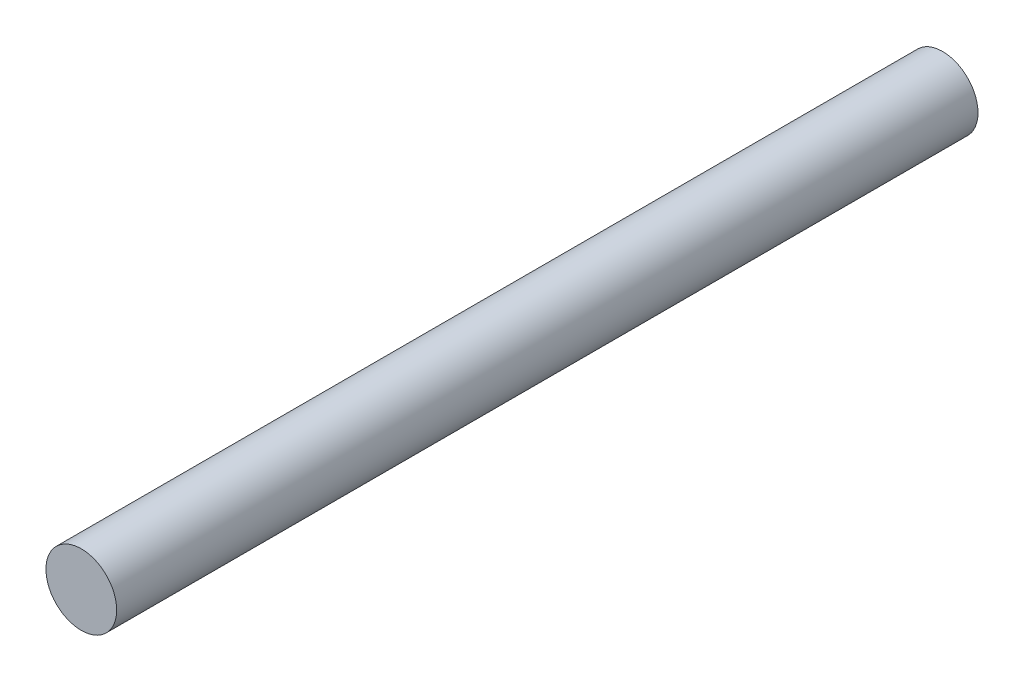
ISO-10303-21;
HEADER;
FILE_DESCRIPTION(('STEP AP214'),'2;1');
FILE_NAME('part.step','',(''),(''),'','','');
FILE_SCHEMA(('AUTOMOTIVE_DESIGN { 1 0 10303 214 1 1 1 1 }'));
ENDSEC;
DATA;
#1=APPLICATION_CONTEXT('core data for automotive mechanical design processes');
#2=APPLICATION_PROTOCOL_DEFINITION('international standard','automotive_design',2000,#1);
#3=PRODUCT_CONTEXT('',#1,'mechanical');
#4=PRODUCT('Part','Part','',(#3));
#5=PRODUCT_RELATED_PRODUCT_CATEGORY('part','',(#4));
#6=PRODUCT_DEFINITION_FORMATION('','',#4);
#7=PRODUCT_DEFINITION_CONTEXT('part definition',#1,'design');
#8=PRODUCT_DEFINITION('design','',#6,#7);
#9=PRODUCT_DEFINITION_SHAPE('','',#8);
#10=(LENGTH_UNIT() NAMED_UNIT(*) SI_UNIT(.MILLI.,.METRE.));
#11=(NAMED_UNIT(*) PLANE_ANGLE_UNIT() SI_UNIT($,.RADIAN.));
#12=(NAMED_UNIT(*) SI_UNIT($,.STERADIAN.) SOLID_ANGLE_UNIT());
#13=UNCERTAINTY_MEASURE_WITH_UNIT(LENGTH_MEASURE(1.E-05),#10,'distance_accuracy_value','');
#14=(GEOMETRIC_REPRESENTATION_CONTEXT(3) GLOBAL_UNCERTAINTY_ASSIGNED_CONTEXT((#13)) GLOBAL_UNIT_ASSIGNED_CONTEXT((#10,
#11,#12)) REPRESENTATION_CONTEXT('',''));
#15=CARTESIAN_POINT('',(0.,0.,0.));
#16=DIRECTION('',(0.,0.,1.));
#17=DIRECTION('',(1.,0.,0.));
#18=AXIS2_PLACEMENT_3D('',#15,#16,#17);
#19=CARTESIAN_POINT('',(0.,1.0196694783552,48.7));
#20=DIRECTION('',(0.,0.,-1.));
#21=DIRECTION('',(-1.,0.,0.));
#22=AXIS2_PLACEMENT_3D('',#19,#20,#21);
#23=CYLINDRICAL_SURFACE('',#22,2.);
#24=CARTESIAN_POINT('',(0.,1.0196694783552,48.7));
#25=DIRECTION('',(0.,0.,1.));
#26=DIRECTION('',(1.,0.,0.));
#27=AXIS2_PLACEMENT_3D('',#24,#25,#26);
#28=CIRCLE('',#27,2.);
#29=CARTESIAN_POINT('',(2.,1.0196694783552,48.7));
#30=VERTEX_POINT('',#29);
#31=EDGE_CURVE('E10',#30,#30,#28,.T.);
#32=ORIENTED_EDGE('',*,*,#31,.F.);
#33=EDGE_LOOP('',(#32));
#34=FACE_BOUND('',#33,.T.);
#35=CARTESIAN_POINT('',(0.,1.0196694783552,0.));
#36=DIRECTION('',(0.,0.,1.));
#37=DIRECTION('',(1.,0.,0.));
#38=AXIS2_PLACEMENT_3D('',#35,#36,#37);
#39=CIRCLE('',#38,2.);
#40=CARTESIAN_POINT('',(2.,1.0196694783552,0.));
#41=VERTEX_POINT('',#40);
#42=EDGE_CURVE('E38',#41,#41,#39,.T.);
#43=ORIENTED_EDGE('',*,*,#42,.T.);
#44=EDGE_LOOP('',(#43));
#45=FACE_BOUND('',#44,.T.);
#46=ADVANCED_FACE('F35',(#34,#45),#23,.T.);
#47=CARTESIAN_POINT('',(0.,1.0196694783552,48.7));
#48=DIRECTION('',(0.,0.,1.));
#49=DIRECTION('',(1.,0.,0.));
#50=AXIS2_PLACEMENT_3D('',#47,#48,#49);
#51=PLANE('',#50);
#52=ORIENTED_EDGE('',*,*,#31,.T.);
#53=EDGE_LOOP('',(#52));
#54=FACE_BOUND('',#53,.T.);
#55=ADVANCED_FACE('F50',(#54),#51,.T.);
#56=CARTESIAN_POINT('',(0.,1.0196694783552,0.));
#57=DIRECTION('',(0.,0.,1.));
#58=DIRECTION('',(1.,0.,0.));
#59=AXIS2_PLACEMENT_3D('',#56,#57,#58);
#60=PLANE('',#59);
#61=ORIENTED_EDGE('',*,*,#42,.F.);
#62=EDGE_LOOP('',(#61));
#63=FACE_BOUND('',#62,.T.);
#64=ADVANCED_FACE('F48',(#63),#60,.F.);
#65=CLOSED_SHELL('',(#46,#55,#64));
#66=MANIFOLD_SOLID_BREP('B2',#65);
#67=ADVANCED_BREP_SHAPE_REPRESENTATION('',(#18,#66),#14);
#68=SHAPE_DEFINITION_REPRESENTATION(#9,#67);
ENDSEC;
END-ISO-10303-21;
